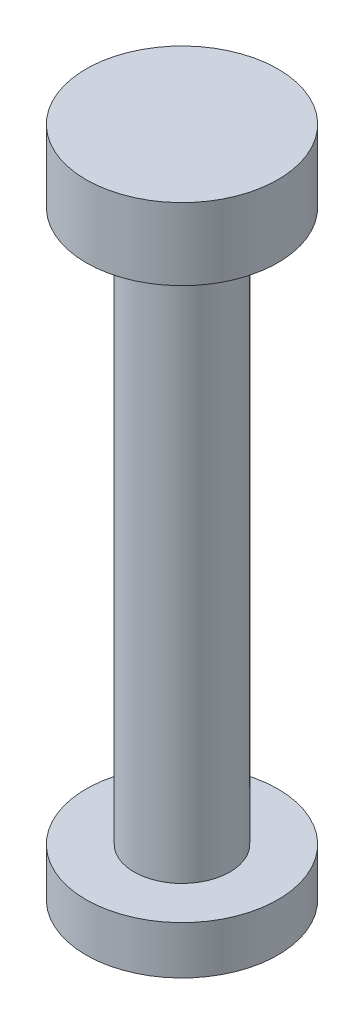
ISO-10303-21;
HEADER;
FILE_DESCRIPTION(('STEP AP214'),'2;1');
FILE_NAME('part.step','',(''),(''),'','','');
FILE_SCHEMA(('AUTOMOTIVE_DESIGN { 1 0 10303 214 1 1 1 1 }'));
ENDSEC;
DATA;
#1=APPLICATION_CONTEXT('core data for automotive mechanical design processes');
#2=APPLICATION_PROTOCOL_DEFINITION('international standard','automotive_design',2000,#1);
#3=PRODUCT_CONTEXT('',#1,'mechanical');
#4=PRODUCT('Part','Part','',(#3));
#5=PRODUCT_RELATED_PRODUCT_CATEGORY('part','',(#4));
#6=PRODUCT_DEFINITION_FORMATION('','',#4);
#7=PRODUCT_DEFINITION_CONTEXT('part definition',#1,'design');
#8=PRODUCT_DEFINITION('design','',#6,#7);
#9=PRODUCT_DEFINITION_SHAPE('','',#8);
#10=(LENGTH_UNIT() NAMED_UNIT(*) SI_UNIT(.MILLI.,.METRE.));
#11=(NAMED_UNIT(*) PLANE_ANGLE_UNIT() SI_UNIT($,.RADIAN.));
#12=(NAMED_UNIT(*) SI_UNIT($,.STERADIAN.) SOLID_ANGLE_UNIT());
#13=UNCERTAINTY_MEASURE_WITH_UNIT(LENGTH_MEASURE(1.E-05),#10,'distance_accuracy_value','');
#14=(GEOMETRIC_REPRESENTATION_CONTEXT(3) GLOBAL_UNCERTAINTY_ASSIGNED_CONTEXT((#13)) GLOBAL_UNIT_ASSIGNED_CONTEXT((#10,
#11,#12)) REPRESENTATION_CONTEXT('',''));
#15=CARTESIAN_POINT('',(0.,0.,0.));
#16=DIRECTION('',(0.,0.,1.));
#17=DIRECTION('',(1.,0.,0.));
#18=AXIS2_PLACEMENT_3D('',#15,#16,#17);
#19=CARTESIAN_POINT('',(0.,26.,0.));
#20=DIRECTION('',(0.,1.,0.));
#21=DIRECTION('',(0.,0.,1.));
#22=AXIS2_PLACEMENT_3D('',#19,#20,#21);
#23=PLANE('',#22);
#24=CARTESIAN_POINT('',(0.,26.,0.));
#25=DIRECTION('',(0.,-1.,0.));
#26=DIRECTION('',(0.,0.,-1.));
#27=AXIS2_PLACEMENT_3D('',#24,#25,#26);
#28=CIRCLE('',#27,4.);
#29=CARTESIAN_POINT('',(0.,26.,-4.));
#30=VERTEX_POINT('',#29);
#31=EDGE_CURVE('E10',#30,#30,#28,.T.);
#32=ORIENTED_EDGE('',*,*,#31,.F.);
#33=EDGE_LOOP('',(#32));
#34=FACE_BOUND('',#33,.T.);
#35=ADVANCED_FACE('F37',(#34),#23,.T.);
#36=CARTESIAN_POINT('',(0.,0.,0.));
#37=DIRECTION('',(0.,-1.,0.));
#38=DIRECTION('',(0.,0.,-1.));
#39=AXIS2_PLACEMENT_3D('',#36,#37,#38);
#40=CYLINDRICAL_SURFACE('',#39,4.);
#41=ORIENTED_EDGE('',*,*,#31,.T.);
#42=EDGE_LOOP('',(#41));
#43=FACE_BOUND('',#42,.T.);
#44=CARTESIAN_POINT('',(0.,23.,0.));
#45=DIRECTION('',(0.,-1.,0.));
#46=DIRECTION('',(0.,0.,-1.));
#47=AXIS2_PLACEMENT_3D('',#44,#45,#46);
#48=CIRCLE('',#47,4.);
#49=CARTESIAN_POINT('',(0.,23.,-4.));
#50=VERTEX_POINT('',#49);
#51=EDGE_CURVE('E44',#50,#50,#48,.T.);
#52=ORIENTED_EDGE('',*,*,#51,.F.);
#53=EDGE_LOOP('',(#52));
#54=FACE_BOUND('',#53,.T.);
#55=ADVANCED_FACE('F85',(#43,#54),#40,.T.);
#56=CARTESIAN_POINT('',(4.,23.,0.));
#57=DIRECTION('',(0.,-1.,0.));
#58=DIRECTION('',(0.,0.,-1.));
#59=AXIS2_PLACEMENT_3D('',#56,#57,#58);
#60=PLANE('',#59);
#61=ORIENTED_EDGE('',*,*,#51,.T.);
#62=EDGE_LOOP('',(#61));
#63=FACE_BOUND('',#62,.T.);
#64=CARTESIAN_POINT('',(0.,23.,0.));
#65=DIRECTION('',(0.,-1.,0.));
#66=DIRECTION('',(0.,0.,-1.));
#67=AXIS2_PLACEMENT_3D('',#64,#65,#66);
#68=CIRCLE('',#67,2.);
#69=CARTESIAN_POINT('',(0.,23.,-2.));
#70=VERTEX_POINT('',#69);
#71=EDGE_CURVE('E49',#70,#70,#68,.T.);
#72=ORIENTED_EDGE('',*,*,#71,.F.);
#73=EDGE_LOOP('',(#72));
#74=FACE_BOUND('',#73,.T.);
#75=ADVANCED_FACE('F90',(#63,#74),#60,.T.);
#76=CARTESIAN_POINT('',(0.,0.,0.));
#77=DIRECTION('',(0.,-1.,0.));
#78=DIRECTION('',(0.,0.,-1.));
#79=AXIS2_PLACEMENT_3D('',#76,#77,#78);
#80=CYLINDRICAL_SURFACE('',#79,2.);
#81=ORIENTED_EDGE('',*,*,#71,.T.);
#82=EDGE_LOOP('',(#81));
#83=FACE_BOUND('',#82,.T.);
#84=CARTESIAN_POINT('',(0.,0.,0.));
#85=DIRECTION('',(0.,-1.,0.));
#86=DIRECTION('',(0.,0.,-1.));
#87=AXIS2_PLACEMENT_3D('',#84,#85,#86);
#88=CIRCLE('',#87,2.);
#89=CARTESIAN_POINT('',(0.,0.,-2.));
#90=VERTEX_POINT('',#89);
#91=EDGE_CURVE('E54',#90,#90,#88,.T.);
#92=ORIENTED_EDGE('',*,*,#91,.F.);
#93=EDGE_LOOP('',(#92));
#94=FACE_BOUND('',#93,.T.);
#95=ADVANCED_FACE('F81',(#83,#94),#80,.T.);
#96=CARTESIAN_POINT('',(2.,0.,0.));
#97=DIRECTION('',(0.,1.,0.));
#98=DIRECTION('',(0.,0.,1.));
#99=AXIS2_PLACEMENT_3D('',#96,#97,#98);
#100=PLANE('',#99);
#101=ORIENTED_EDGE('',*,*,#91,.T.);
#102=EDGE_LOOP('',(#101));
#103=FACE_BOUND('',#102,.T.);
#104=CARTESIAN_POINT('',(0.,0.,0.));
#105=DIRECTION('',(0.,-1.,0.));
#106=DIRECTION('',(0.,0.,-1.));
#107=AXIS2_PLACEMENT_3D('',#104,#105,#106);
#108=CIRCLE('',#107,4.);
#109=CARTESIAN_POINT('',(0.,0.,-4.));
#110=VERTEX_POINT('',#109);
#111=EDGE_CURVE('E60',#110,#110,#108,.T.);
#112=ORIENTED_EDGE('',*,*,#111,.F.);
#113=EDGE_LOOP('',(#112));
#114=FACE_BOUND('',#113,.T.);
#115=ADVANCED_FACE('F73',(#103,#114),#100,.T.);
#116=CARTESIAN_POINT('',(0.,0.,0.));
#117=DIRECTION('',(0.,-1.,0.));
#118=DIRECTION('',(0.,0.,-1.));
#119=AXIS2_PLACEMENT_3D('',#116,#117,#118);
#120=CYLINDRICAL_SURFACE('',#119,4.);
#121=ORIENTED_EDGE('',*,*,#111,.T.);
#122=EDGE_LOOP('',(#121));
#123=FACE_BOUND('',#122,.T.);
#124=CARTESIAN_POINT('',(0.,-2.,0.));
#125=DIRECTION('',(0.,-1.,0.));
#126=DIRECTION('',(0.,0.,-1.));
#127=AXIS2_PLACEMENT_3D('',#124,#125,#126);
#128=CIRCLE('',#127,4.);
#129=CARTESIAN_POINT('',(0.,-2.,-4.));
#130=VERTEX_POINT('',#129);
#131=EDGE_CURVE('E64',#130,#130,#128,.T.);
#132=ORIENTED_EDGE('',*,*,#131,.F.);
#133=EDGE_LOOP('',(#132));
#134=FACE_BOUND('',#133,.T.);
#135=ADVANCED_FACE('F71',(#123,#134),#120,.T.);
#136=CARTESIAN_POINT('',(4.,-2.,0.));
#137=DIRECTION('',(0.,-1.,0.));
#138=DIRECTION('',(0.,0.,-1.));
#139=AXIS2_PLACEMENT_3D('',#136,#137,#138);
#140=PLANE('',#139);
#141=ORIENTED_EDGE('',*,*,#131,.T.);
#142=EDGE_LOOP('',(#141));
#143=FACE_BOUND('',#142,.T.);
#144=ADVANCED_FACE('F69',(#143),#140,.T.);
#145=CLOSED_SHELL('',(#35,#55,#75,#95,#115,#135,#144));
#146=MANIFOLD_SOLID_BREP('B2',#145);
#147=ADVANCED_BREP_SHAPE_REPRESENTATION('',(#18,#146),#14);
#148=SHAPE_DEFINITION_REPRESENTATION(#9,#147);
ENDSEC;
END-ISO-10303-21;
